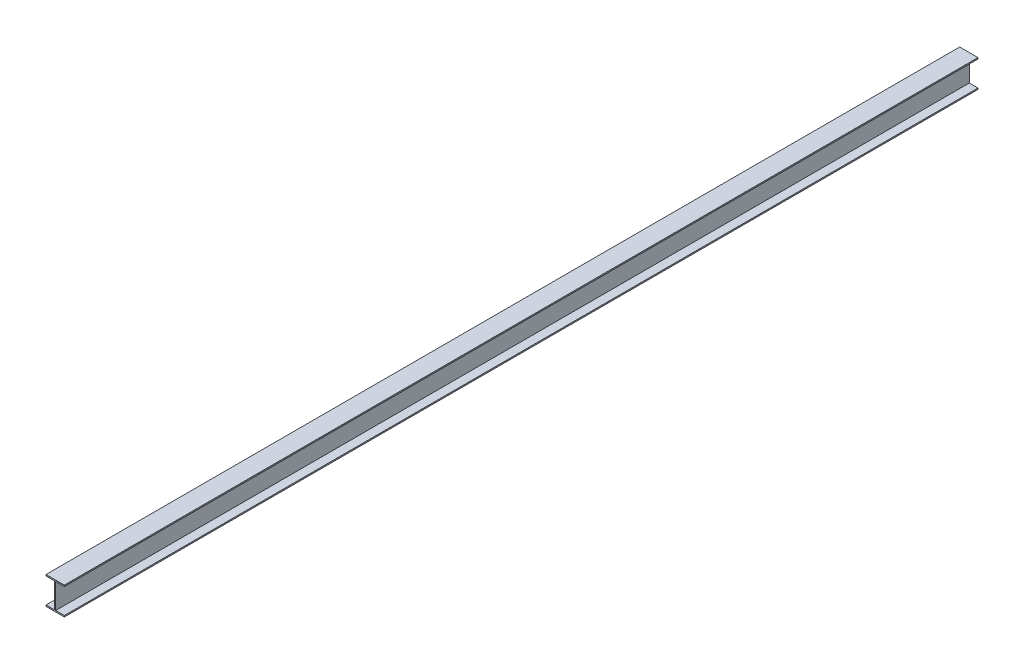
ISO-10303-21;
HEADER;
FILE_DESCRIPTION(('STEP AP214'),'2;1');
FILE_NAME('part.step','',(''),(''),'','','');
FILE_SCHEMA(('AUTOMOTIVE_DESIGN { 1 0 10303 214 1 1 1 1 }'));
ENDSEC;
DATA;
#1=APPLICATION_CONTEXT('core data for automotive mechanical design processes');
#2=APPLICATION_PROTOCOL_DEFINITION('international standard','automotive_design',2000,#1);
#3=PRODUCT_CONTEXT('',#1,'mechanical');
#4=PRODUCT('Part','Part','',(#3));
#5=PRODUCT_RELATED_PRODUCT_CATEGORY('part','',(#4));
#6=PRODUCT_DEFINITION_FORMATION('','',#4);
#7=PRODUCT_DEFINITION_CONTEXT('part definition',#1,'design');
#8=PRODUCT_DEFINITION('design','',#6,#7);
#9=PRODUCT_DEFINITION_SHAPE('','',#8);
#10=(LENGTH_UNIT() NAMED_UNIT(*) SI_UNIT(.MILLI.,.METRE.));
#11=(NAMED_UNIT(*) PLANE_ANGLE_UNIT() SI_UNIT($,.RADIAN.));
#12=(NAMED_UNIT(*) SI_UNIT($,.STERADIAN.) SOLID_ANGLE_UNIT());
#13=UNCERTAINTY_MEASURE_WITH_UNIT(LENGTH_MEASURE(1.E-05),#10,'distance_accuracy_value','');
#14=(GEOMETRIC_REPRESENTATION_CONTEXT(3) GLOBAL_UNCERTAINTY_ASSIGNED_CONTEXT((#13)) GLOBAL_UNIT_ASSIGNED_CONTEXT((#10,
#11,#12)) REPRESENTATION_CONTEXT('',''));
#15=CARTESIAN_POINT('',(0.,0.,0.));
#16=DIRECTION('',(0.,0.,1.));
#17=DIRECTION('',(1.,0.,0.));
#18=AXIS2_PLACEMENT_3D('',#15,#16,#17);
#19=CARTESIAN_POINT('',(101.6,-153.162240532958,3510.));
#20=DIRECTION('',(0.,1.,0.));
#21=DIRECTION('',(0.,0.,1.));
#22=AXIS2_PLACEMENT_3D('',#19,#20,#21);
#23=PLANE('',#22);
#24=DIRECTION('',(1.,0.,0.));
#25=VECTOR('',#24,1.);
#26=CARTESIAN_POINT('',(101.6,-153.162240532958,1603.7680912575));
#27=LINE('',#26,#25);
#28=CARTESIAN_POINT('',(0.,-153.162240532958,1603.7680912575));
#29=VERTEX_POINT('',#28);
#30=CARTESIAN_POINT('',(101.6,-153.162240532958,1603.7680912575));
#31=VERTEX_POINT('',#30);
#32=EDGE_CURVE('E11',#29,#31,#27,.T.);
#33=ORIENTED_EDGE('',*,*,#32,.F.);
#34=DIRECTION('',(0.,0.,-1.));
#35=VECTOR('',#34,1.);
#36=CARTESIAN_POINT('',(0.,-153.162240532958,3510.));
#37=LINE('',#36,#35);
#38=CARTESIAN_POINT('',(0.,-153.162240532958,-774.831908742346));
#39=VERTEX_POINT('',#38);
#40=EDGE_CURVE('E239',#29,#39,#37,.T.);
#41=ORIENTED_EDGE('',*,*,#40,.T.);
#42=DIRECTION('',(-1.,0.,0.));
#43=VECTOR('',#42,1.);
#44=CARTESIAN_POINT('',(101.599999999998,-153.162240532958,-774.831908742345));
#45=LINE('',#44,#43);
#46=CARTESIAN_POINT('',(101.6,-153.162240532958,-774.831908742345));
#47=VERTEX_POINT('',#46);
#48=EDGE_CURVE('E168',#47,#39,#45,.T.);
#49=ORIENTED_EDGE('',*,*,#48,.F.);
#50=DIRECTION('',(0.,0.,-1.));
#51=VECTOR('',#50,1.);
#52=CARTESIAN_POINT('',(101.6,-153.162240532958,3510.));
#53=LINE('',#52,#51);
#54=EDGE_CURVE('E235',#31,#47,#53,.T.);
#55=ORIENTED_EDGE('',*,*,#54,.F.);
#56=EDGE_LOOP('',(#33,#41,#49,#55));
#57=FACE_BOUND('',#56,.T.);
#58=ADVANCED_FACE('F37',(#57),#23,.F.);
#59=DIRECTION('',(-1.,0.,0.));
#60=VECTOR('',#59,1.);
#61=CARTESIAN_POINT('',(101.6,-153.162240532958,1908.5680912575));
#62=LINE('',#61,#60);
#63=CARTESIAN_POINT('',(101.6,-153.162240532958,1908.5680912575));
#64=VERTEX_POINT('',#63);
#65=CARTESIAN_POINT('',(0.,-153.162240532958,1908.5680912575));
#66=VERTEX_POINT('',#65);
#67=EDGE_CURVE('E46',#64,#66,#62,.T.);
#68=ORIENTED_EDGE('',*,*,#67,.F.);
#69=CARTESIAN_POINT('',(101.6,-153.162240532958,4287.16809125763));
#70=VERTEX_POINT('',#69);
#71=EDGE_CURVE('E236',#70,#64,#53,.T.);
#72=ORIENTED_EDGE('',*,*,#71,.F.);
#73=DIRECTION('',(1.,0.,0.));
#74=VECTOR('',#73,1.);
#75=CARTESIAN_POINT('',(1.6063049101718E-12,-153.162240532958,4287.16809125763));
#76=LINE('',#75,#74);
#77=CARTESIAN_POINT('',(0.,-153.162240532958,4287.16809125763));
#78=VERTEX_POINT('',#77);
#79=EDGE_CURVE('E207',#78,#70,#76,.T.);
#80=ORIENTED_EDGE('',*,*,#79,.F.);
#81=EDGE_CURVE('E241',#78,#66,#37,.T.);
#82=ORIENTED_EDGE('',*,*,#81,.T.);
#83=EDGE_LOOP('',(#68,#72,#80,#82));
#84=FACE_BOUND('',#83,.T.);
#85=ADVANCED_FACE('F292',(#84),#23,.F.);
#86=CARTESIAN_POINT('',(0.,-7.11224053295814,3510.));
#87=DIRECTION('',(1.,0.,0.));
#88=DIRECTION('',(0.,0.,-1.));
#89=AXIS2_PLACEMENT_3D('',#86,#87,#88);
#90=PLANE('',#89);
#91=DIRECTION('',(0.,0.,-1.));
#92=VECTOR('',#91,1.);
#93=CARTESIAN_POINT('',(0.,-0.000240532958142959,3510.));
#94=LINE('',#93,#92);
#95=CARTESIAN_POINT('',(0.,-0.000240532958142959,4287.16809125763));
#96=VERTEX_POINT('',#95);
#97=CARTESIAN_POINT('',(0.,-0.000240532958142959,-774.831908742345));
#98=VERTEX_POINT('',#97);
#99=EDGE_CURVE('E197',#96,#98,#94,.T.);
#100=ORIENTED_EDGE('',*,*,#99,.T.);
#101=DIRECTION('',(0.,1.,0.));
#102=VECTOR('',#101,1.);
#103=CARTESIAN_POINT('',(0.,-7.11224053295893,-774.831908742345));
#104=LINE('',#103,#102);
#105=CARTESIAN_POINT('',(0.,-7.11224053295814,-774.831908742345));
#106=VERTEX_POINT('',#105);
#107=EDGE_CURVE('E190',#106,#98,#104,.T.);
#108=ORIENTED_EDGE('',*,*,#107,.F.);
#109=DIRECTION('',(0.,0.,-1.));
#110=VECTOR('',#109,1.);
#111=CARTESIAN_POINT('',(0.,-7.11224053295814,3510.));
#112=LINE('',#111,#110);
#113=CARTESIAN_POINT('',(0.,-7.11224053295814,4287.16809125763));
#114=VERTEX_POINT('',#113);
#115=EDGE_CURVE('E247',#114,#106,#112,.T.);
#116=ORIENTED_EDGE('',*,*,#115,.F.);
#117=DIRECTION('',(0.,-1.,0.));
#118=VECTOR('',#117,1.);
#119=CARTESIAN_POINT('',(0.,-0.000240532957350829,4287.16809125763));
#120=LINE('',#119,#118);
#121=EDGE_CURVE('E219',#96,#114,#120,.T.);
#122=ORIENTED_EDGE('',*,*,#121,.F.);
#123=EDGE_LOOP('',(#100,#108,#116,#122));
#124=FACE_BOUND('',#123,.T.);
#125=ADVANCED_FACE('F39',(#124),#90,.F.);
#126=CARTESIAN_POINT('',(47.5660357142857,-7.11224053295814,3510.));
#127=DIRECTION('',(0.,1.,0.));
#128=DIRECTION('',(-1.,0.,0.));
#129=AXIS2_PLACEMENT_3D('',#126,#127,#128);
#130=PLANE('',#129);
#131=ORIENTED_EDGE('',*,*,#115,.T.);
#132=DIRECTION('',(-1.,0.,0.));
#133=VECTOR('',#132,1.);
#134=CARTESIAN_POINT('',(47.5660357142841,-7.11224053295814,-774.831908742345));
#135=LINE('',#134,#133);
#136=CARTESIAN_POINT('',(47.5660357142857,-7.11224053295814,-774.831908742345));
#137=VERTEX_POINT('',#136);
#138=EDGE_CURVE('E157',#137,#106,#135,.T.);
#139=ORIENTED_EDGE('',*,*,#138,.F.);
#140=DIRECTION('',(0.,0.,-1.));
#141=VECTOR('',#140,1.);
#142=CARTESIAN_POINT('',(47.5660357142857,-7.11224053295814,3510.));
#143=LINE('',#142,#141);
#144=CARTESIAN_POINT('',(47.5660357142857,-7.11224053295814,4287.16809125763));
#145=VERTEX_POINT('',#144);
#146=EDGE_CURVE('E148',#145,#137,#143,.T.);
#147=ORIENTED_EDGE('',*,*,#146,.F.);
#148=DIRECTION('',(1.,0.,0.));
#149=VECTOR('',#148,1.);
#150=CARTESIAN_POINT('',(1.57854933455617E-12,-7.11224053295814,4287.16809125763));
#151=LINE('',#150,#149);
#152=EDGE_CURVE('E216',#114,#145,#151,.T.);
#153=ORIENTED_EDGE('',*,*,#152,.F.);
#154=EDGE_LOOP('',(#131,#139,#147,#153));
#155=FACE_BOUND('',#154,.T.);
#156=ADVANCED_FACE('F256',(#155),#130,.F.);
#157=CARTESIAN_POINT('',(47.5660357142857,-146.050240532958,3510.));
#158=DIRECTION('',(1.,0.,0.));
#159=DIRECTION('',(0.,0.,-1.));
#160=AXIS2_PLACEMENT_3D('',#157,#158,#159);
#161=PLANE('',#160);
#162=ORIENTED_EDGE('',*,*,#146,.T.);
#163=DIRECTION('',(0.,1.,0.));
#164=VECTOR('',#163,1.);
#165=CARTESIAN_POINT('',(47.5660357142857,-146.050240532959,-774.831908742345));
#166=LINE('',#165,#164);
#167=CARTESIAN_POINT('',(47.5660357142857,-146.050240532958,-774.831908742345));
#168=VERTEX_POINT('',#167);
#169=EDGE_CURVE('E152',#168,#137,#166,.T.);
#170=ORIENTED_EDGE('',*,*,#169,.F.);
#171=DIRECTION('',(0.,0.,-1.));
#172=VECTOR('',#171,1.);
#173=CARTESIAN_POINT('',(47.5660357142857,-146.050240532958,3510.));
#174=LINE('',#173,#172);
#175=CARTESIAN_POINT('',(47.5660357142857,-146.050240532958,4287.16809125763));
#176=VERTEX_POINT('',#175);
#177=EDGE_CURVE('E137',#176,#168,#174,.T.);
#178=ORIENTED_EDGE('',*,*,#177,.F.);
#179=DIRECTION('',(0.,-1.,0.));
#180=VECTOR('',#179,1.);
#181=CARTESIAN_POINT('',(47.5660357142857,-7.11224053295735,4287.16809125763));
#182=LINE('',#181,#180);
#183=EDGE_CURVE('E214',#145,#176,#182,.T.);
#184=ORIENTED_EDGE('',*,*,#183,.F.);
#185=EDGE_LOOP('',(#162,#170,#178,#184));
#186=FACE_BOUND('',#185,.T.);
#187=ADVANCED_FACE('F153',(#186),#161,.F.);
#188=CARTESIAN_POINT('',(0.,-146.050240532958,3510.));
#189=DIRECTION('',(0.,-1.,0.));
#190=DIRECTION('',(1.,0.,0.));
#191=AXIS2_PLACEMENT_3D('',#188,#189,#190);
#192=PLANE('',#191);
#193=ORIENTED_EDGE('',*,*,#177,.T.);
#194=DIRECTION('',(1.,0.,0.));
#195=VECTOR('',#194,1.);
#196=CARTESIAN_POINT('',(-1.6063049101718E-12,-146.050240532958,-774.831908742346));
#197=LINE('',#196,#195);
#198=CARTESIAN_POINT('',(0.,-146.050240532958,-774.831908742345));
#199=VERTEX_POINT('',#198);
#200=EDGE_CURVE('E141',#199,#168,#197,.T.);
#201=ORIENTED_EDGE('',*,*,#200,.F.);
#202=DIRECTION('',(0.,0.,-1.));
#203=VECTOR('',#202,1.);
#204=CARTESIAN_POINT('',(0.,-146.050240532958,3510.));
#205=LINE('',#204,#203);
#206=CARTESIAN_POINT('',(0.,-146.050240532958,4287.16809125763));
#207=VERTEX_POINT('',#206);
#208=EDGE_CURVE('E149',#207,#199,#205,.T.);
#209=ORIENTED_EDGE('',*,*,#208,.F.);
#210=DIRECTION('',(-1.,0.,0.));
#211=VECTOR('',#210,1.);
#212=CARTESIAN_POINT('',(47.5660357142873,-146.050240532958,4287.16809125763));
#213=LINE('',#212,#211);
#214=EDGE_CURVE('E144',#176,#207,#213,.T.);
#215=ORIENTED_EDGE('',*,*,#214,.F.);
#216=EDGE_LOOP('',(#193,#201,#209,#215));
#217=FACE_BOUND('',#216,.T.);
#218=ADVANCED_FACE('F139',(#217),#192,.F.);
#219=CARTESIAN_POINT('',(0.,-153.162240532958,3510.));
#220=DIRECTION('',(1.,0.,0.));
#221=DIRECTION('',(0.,0.,-1.));
#222=AXIS2_PLACEMENT_3D('',#219,#220,#221);
#223=PLANE('',#222);
#224=ORIENTED_EDGE('',*,*,#208,.T.);
#225=DIRECTION('',(0.,1.,0.));
#226=VECTOR('',#225,1.);
#227=CARTESIAN_POINT('',(0.,-153.162240532959,-774.831908742346));
#228=LINE('',#227,#226);
#229=EDGE_CURVE('E162',#39,#199,#228,.T.);
#230=ORIENTED_EDGE('',*,*,#229,.F.);
#231=ORIENTED_EDGE('',*,*,#40,.F.);
#232=EDGE_CURVE('E244',#66,#29,#37,.T.);
#233=ORIENTED_EDGE('',*,*,#232,.F.);
#234=ORIENTED_EDGE('',*,*,#81,.F.);
#235=DIRECTION('',(0.,-1.,0.));
#236=VECTOR('',#235,1.);
#237=CARTESIAN_POINT('',(0.,-146.050240532957,4287.16809125763));
#238=LINE('',#237,#236);
#239=EDGE_CURVE('E210',#207,#78,#238,.T.);
#240=ORIENTED_EDGE('',*,*,#239,.F.);
#241=EDGE_LOOP('',(#224,#230,#231,#233,#234,#240));
#242=FACE_BOUND('',#241,.T.);
#243=ADVANCED_FACE('F286',(#242),#223,.F.);
#244=ORIENTED_EDGE('',*,*,#232,.T.);
#245=ORIENTED_EDGE('',*,*,#32,.T.);
#246=EDGE_CURVE('E240',#64,#31,#53,.T.);
#247=ORIENTED_EDGE('',*,*,#246,.F.);
#248=ORIENTED_EDGE('',*,*,#67,.T.);
#249=EDGE_LOOP('',(#244,#245,#247,#248));
#250=FACE_BOUND('',#249,.T.);
#251=ADVANCED_FACE('F293',(#250),#23,.F.);
#252=CARTESIAN_POINT('',(101.6,-146.050240532958,3510.));
#253=DIRECTION('',(-1.,0.,0.));
#254=DIRECTION('',(0.,0.,1.));
#255=AXIS2_PLACEMENT_3D('',#252,#253,#254);
#256=PLANE('',#255);
#257=ORIENTED_EDGE('',*,*,#54,.T.);
#258=DIRECTION('',(0.,-1.,0.));
#259=VECTOR('',#258,1.);
#260=CARTESIAN_POINT('',(101.6,-146.050240532959,-774.831908742345));
#261=LINE('',#260,#259);
#262=CARTESIAN_POINT('',(101.6,-146.050240532958,-774.831908742345));
#263=VERTEX_POINT('',#262);
#264=EDGE_CURVE('E172',#263,#47,#261,.T.);
#265=ORIENTED_EDGE('',*,*,#264,.F.);
#266=DIRECTION('',(0.,0.,-1.));
#267=VECTOR('',#266,1.);
#268=CARTESIAN_POINT('',(101.6,-146.050240532958,3510.));
#269=LINE('',#268,#267);
#270=CARTESIAN_POINT('',(101.6,-146.050240532958,4287.16809125763));
#271=VERTEX_POINT('',#270);
#272=EDGE_CURVE('E233',#271,#263,#269,.T.);
#273=ORIENTED_EDGE('',*,*,#272,.F.);
#274=DIRECTION('',(0.,1.,0.));
#275=VECTOR('',#274,1.);
#276=CARTESIAN_POINT('',(101.6,-153.162240532957,4287.16809125763));
#277=LINE('',#276,#275);
#278=EDGE_CURVE('E204',#70,#271,#277,.T.);
#279=ORIENTED_EDGE('',*,*,#278,.F.);
#280=ORIENTED_EDGE('',*,*,#71,.T.);
#281=ORIENTED_EDGE('',*,*,#246,.T.);
#282=EDGE_LOOP('',(#257,#265,#273,#279,#280,#281));
#283=FACE_BOUND('',#282,.T.);
#284=ADVANCED_FACE('F282',(#283),#256,.F.);
#285=CARTESIAN_POINT('',(53.4080357142857,-146.050240532958,3510.));
#286=DIRECTION('',(0.,-1.,0.));
#287=DIRECTION('',(1.,0.,0.));
#288=AXIS2_PLACEMENT_3D('',#285,#286,#287);
#289=PLANE('',#288);
#290=ORIENTED_EDGE('',*,*,#272,.T.);
#291=DIRECTION('',(1.,0.,0.));
#292=VECTOR('',#291,1.);
#293=CARTESIAN_POINT('',(53.4080357142841,-146.050240532958,-774.831908742345));
#294=LINE('',#293,#292);
#295=CARTESIAN_POINT('',(53.4080357142857,-146.050240532958,-774.831908742345));
#296=VERTEX_POINT('',#295);
#297=EDGE_CURVE('E175',#296,#263,#294,.T.);
#298=ORIENTED_EDGE('',*,*,#297,.F.);
#299=DIRECTION('',(0.,0.,-1.));
#300=VECTOR('',#299,1.);
#301=CARTESIAN_POINT('',(53.4080357142857,-146.050240532958,3510.));
#302=LINE('',#301,#300);
#303=CARTESIAN_POINT('',(53.4080357142857,-146.050240532958,4287.16809125763));
#304=VERTEX_POINT('',#303);
#305=EDGE_CURVE('E231',#304,#296,#302,.T.);
#306=ORIENTED_EDGE('',*,*,#305,.F.);
#307=DIRECTION('',(-1.,0.,0.));
#308=VECTOR('',#307,1.);
#309=CARTESIAN_POINT('',(101.600000000002,-146.050240532958,4287.16809125763));
#310=LINE('',#309,#308);
#311=EDGE_CURVE('E201',#271,#304,#310,.T.);
#312=ORIENTED_EDGE('',*,*,#311,.F.);
#313=EDGE_LOOP('',(#290,#298,#306,#312));
#314=FACE_BOUND('',#313,.T.);
#315=ADVANCED_FACE('F278',(#314),#289,.F.);
#316=CARTESIAN_POINT('',(53.4080357142857,-7.11224053295815,3510.));
#317=DIRECTION('',(-1.,0.,0.));
#318=DIRECTION('',(0.,-1.,0.));
#319=AXIS2_PLACEMENT_3D('',#316,#317,#318);
#320=PLANE('',#319);
#321=ORIENTED_EDGE('',*,*,#305,.T.);
#322=DIRECTION('',(0.,-1.,0.));
#323=VECTOR('',#322,1.);
#324=CARTESIAN_POINT('',(53.4080357142857,-7.11224053295894,-774.831908742345));
#325=LINE('',#324,#323);
#326=CARTESIAN_POINT('',(53.4080357142857,-7.11224053295815,-774.831908742345));
#327=VERTEX_POINT('',#326);
#328=EDGE_CURVE('E178',#327,#296,#325,.T.);
#329=ORIENTED_EDGE('',*,*,#328,.F.);
#330=DIRECTION('',(0.,0.,-1.));
#331=VECTOR('',#330,1.);
#332=CARTESIAN_POINT('',(53.4080357142857,-7.11224053295815,3510.));
#333=LINE('',#332,#331);
#334=CARTESIAN_POINT('',(53.4080357142857,-7.11224053295815,4287.16809125763));
#335=VERTEX_POINT('',#334);
#336=EDGE_CURVE('E229',#335,#327,#333,.T.);
#337=ORIENTED_EDGE('',*,*,#336,.F.);
#338=DIRECTION('',(0.,1.,0.));
#339=VECTOR('',#338,1.);
#340=CARTESIAN_POINT('',(53.4080357142857,-146.050240532957,4287.16809125763));
#341=LINE('',#340,#339);
#342=EDGE_CURVE('E198',#304,#335,#341,.T.);
#343=ORIENTED_EDGE('',*,*,#342,.F.);
#344=EDGE_LOOP('',(#321,#329,#337,#343));
#345=FACE_BOUND('',#344,.T.);
#346=ADVANCED_FACE('F274',(#345),#320,.F.);
#347=CARTESIAN_POINT('',(101.6,-7.11224053295814,3510.));
#348=DIRECTION('',(0.,1.,0.));
#349=DIRECTION('',(-1.,0.,0.));
#350=AXIS2_PLACEMENT_3D('',#347,#348,#349);
#351=PLANE('',#350);
#352=ORIENTED_EDGE('',*,*,#336,.T.);
#353=DIRECTION('',(-1.,0.,0.));
#354=VECTOR('',#353,1.);
#355=CARTESIAN_POINT('',(101.599999999998,-7.11224053295814,-774.831908742344));
#356=LINE('',#355,#354);
#357=CARTESIAN_POINT('',(101.6,-7.11224053295814,-774.831908742344));
#358=VERTEX_POINT('',#357);
#359=EDGE_CURVE('E181',#358,#327,#356,.T.);
#360=ORIENTED_EDGE('',*,*,#359,.F.);
#361=DIRECTION('',(0.,0.,-1.));
#362=VECTOR('',#361,1.);
#363=CARTESIAN_POINT('',(101.6,-7.11224053295814,3510.));
#364=LINE('',#363,#362);
#365=CARTESIAN_POINT('',(101.6,-7.11224053295814,4287.16809125763));
#366=VERTEX_POINT('',#365);
#367=EDGE_CURVE('E227',#366,#358,#364,.T.);
#368=ORIENTED_EDGE('',*,*,#367,.F.);
#369=DIRECTION('',(1.,0.,0.));
#370=VECTOR('',#369,1.);
#371=CARTESIAN_POINT('',(53.4080357142873,-7.11224053295815,4287.16809125763));
#372=LINE('',#371,#370);
#373=EDGE_CURVE('E194',#335,#366,#372,.T.);
#374=ORIENTED_EDGE('',*,*,#373,.F.);
#375=EDGE_LOOP('',(#352,#360,#368,#374));
#376=FACE_BOUND('',#375,.T.);
#377=ADVANCED_FACE('F270',(#376),#351,.F.);
#378=CARTESIAN_POINT('',(101.6,-0.000240532958130516,3510.));
#379=DIRECTION('',(-1.,0.,0.));
#380=DIRECTION('',(0.,0.,1.));
#381=AXIS2_PLACEMENT_3D('',#378,#379,#380);
#382=PLANE('',#381);
#383=ORIENTED_EDGE('',*,*,#367,.T.);
#384=DIRECTION('',(0.,-1.,0.));
#385=VECTOR('',#384,1.);
#386=CARTESIAN_POINT('',(101.6,-0.000240532958922646,-774.831908742344));
#387=LINE('',#386,#385);
#388=CARTESIAN_POINT('',(101.6,-0.000240532958130516,-774.831908742344));
#389=VERTEX_POINT('',#388);
#390=EDGE_CURVE('E184',#389,#358,#387,.T.);
#391=ORIENTED_EDGE('',*,*,#390,.F.);
#392=DIRECTION('',(0.,0.,-1.));
#393=VECTOR('',#392,1.);
#394=CARTESIAN_POINT('',(101.6,-0.000240532958130516,3510.));
#395=LINE('',#394,#393);
#396=CARTESIAN_POINT('',(101.6,-0.000240532958130195,4287.16809125763));
#397=VERTEX_POINT('',#396);
#398=EDGE_CURVE('E225',#397,#389,#395,.T.);
#399=ORIENTED_EDGE('',*,*,#398,.F.);
#400=DIRECTION('',(0.,1.,0.));
#401=VECTOR('',#400,1.);
#402=CARTESIAN_POINT('',(101.6,-7.11224053295735,4287.16809125763));
#403=LINE('',#402,#401);
#404=EDGE_CURVE('E163',#366,#397,#403,.T.);
#405=ORIENTED_EDGE('',*,*,#404,.F.);
#406=EDGE_LOOP('',(#383,#391,#399,#405));
#407=FACE_BOUND('',#406,.T.);
#408=ADVANCED_FACE('F266',(#407),#382,.F.);
#409=CARTESIAN_POINT('',(0.,-0.000240532958142959,3510.));
#410=DIRECTION('',(0.,-1.,0.));
#411=DIRECTION('',(1.,0.,0.));
#412=AXIS2_PLACEMENT_3D('',#409,#410,#411);
#413=PLANE('',#412);
#414=ORIENTED_EDGE('',*,*,#398,.T.);
#415=DIRECTION('',(1.,0.,0.));
#416=VECTOR('',#415,1.);
#417=CARTESIAN_POINT('',(-1.63406048578744E-12,-0.000240532958142959,-774.831908742345));
#418=LINE('',#417,#416);
#419=EDGE_CURVE('E187',#98,#389,#418,.T.);
#420=ORIENTED_EDGE('',*,*,#419,.F.);
#421=ORIENTED_EDGE('',*,*,#99,.F.);
#422=DIRECTION('',(-1.,0.,0.));
#423=VECTOR('',#422,1.);
#424=CARTESIAN_POINT('',(101.600000000002,-0.000240532958130516,4287.16809125763));
#425=LINE('',#424,#423);
#426=EDGE_CURVE('E166',#397,#96,#425,.T.);
#427=ORIENTED_EDGE('',*,*,#426,.F.);
#428=EDGE_LOOP('',(#414,#420,#421,#427));
#429=FACE_BOUND('',#428,.T.);
#430=ADVANCED_FACE('F262',(#429),#413,.F.);
#431=CARTESIAN_POINT('',(1105.7365572046,-0.194288280150334,4287.16809125764));
#432=DIRECTION('',(0.,0.,0.999999999999975));
#433=DIRECTION('',(-0.999999999999987,0.,0.));
#434=AXIS2_PLACEMENT_3D('',#431,#432,#433);
#435=PLANE('',#434);
#436=ORIENTED_EDGE('',*,*,#404,.T.);
#437=ORIENTED_EDGE('',*,*,#426,.T.);
#438=ORIENTED_EDGE('',*,*,#121,.T.);
#439=ORIENTED_EDGE('',*,*,#152,.T.);
#440=ORIENTED_EDGE('',*,*,#183,.T.);
#441=ORIENTED_EDGE('',*,*,#214,.T.);
#442=ORIENTED_EDGE('',*,*,#239,.T.);
#443=ORIENTED_EDGE('',*,*,#79,.T.);
#444=ORIENTED_EDGE('',*,*,#278,.T.);
#445=ORIENTED_EDGE('',*,*,#311,.T.);
#446=ORIENTED_EDGE('',*,*,#342,.T.);
#447=ORIENTED_EDGE('',*,*,#373,.T.);
#448=EDGE_LOOP('',(#436,#437,#438,#439,#440,#441,#442,#443,#444,#445,#446,#447));
#449=FACE_BOUND('',#448,.T.);
#450=ADVANCED_FACE('F290',(#449),#435,.T.);
#451=CARTESIAN_POINT('',(1105.73655720456,-7.30628828015151,-774.831908742335));
#452=DIRECTION('',(0.,0.,-0.999999999999975));
#453=DIRECTION('',(0.999999999999988,0.,0.));
#454=AXIS2_PLACEMENT_3D('',#451,#452,#453);
#455=PLANE('',#454);
#456=ORIENTED_EDGE('',*,*,#169,.T.);
#457=ORIENTED_EDGE('',*,*,#138,.T.);
#458=ORIENTED_EDGE('',*,*,#107,.T.);
#459=ORIENTED_EDGE('',*,*,#419,.T.);
#460=ORIENTED_EDGE('',*,*,#390,.T.);
#461=ORIENTED_EDGE('',*,*,#359,.T.);
#462=ORIENTED_EDGE('',*,*,#328,.T.);
#463=ORIENTED_EDGE('',*,*,#297,.T.);
#464=ORIENTED_EDGE('',*,*,#264,.T.);
#465=ORIENTED_EDGE('',*,*,#48,.T.);
#466=ORIENTED_EDGE('',*,*,#229,.T.);
#467=ORIENTED_EDGE('',*,*,#200,.T.);
#468=EDGE_LOOP('',(#456,#457,#458,#459,#460,#461,#462,#463,#464,#465,#466,#467));
#469=FACE_BOUND('',#468,.T.);
#470=ADVANCED_FACE('F159',(#469),#455,.T.);
#471=CLOSED_SHELL('',(#58,#85,#125,#156,#187,#218,#243,#251,#284,#315,#346,#377,#408,#430,#450,#470));
#472=MANIFOLD_SOLID_BREP('B2',#471);
#473=ADVANCED_BREP_SHAPE_REPRESENTATION('',(#18,#472),#14);
#474=SHAPE_DEFINITION_REPRESENTATION(#9,#473);
ENDSEC;
END-ISO-10303-21;
